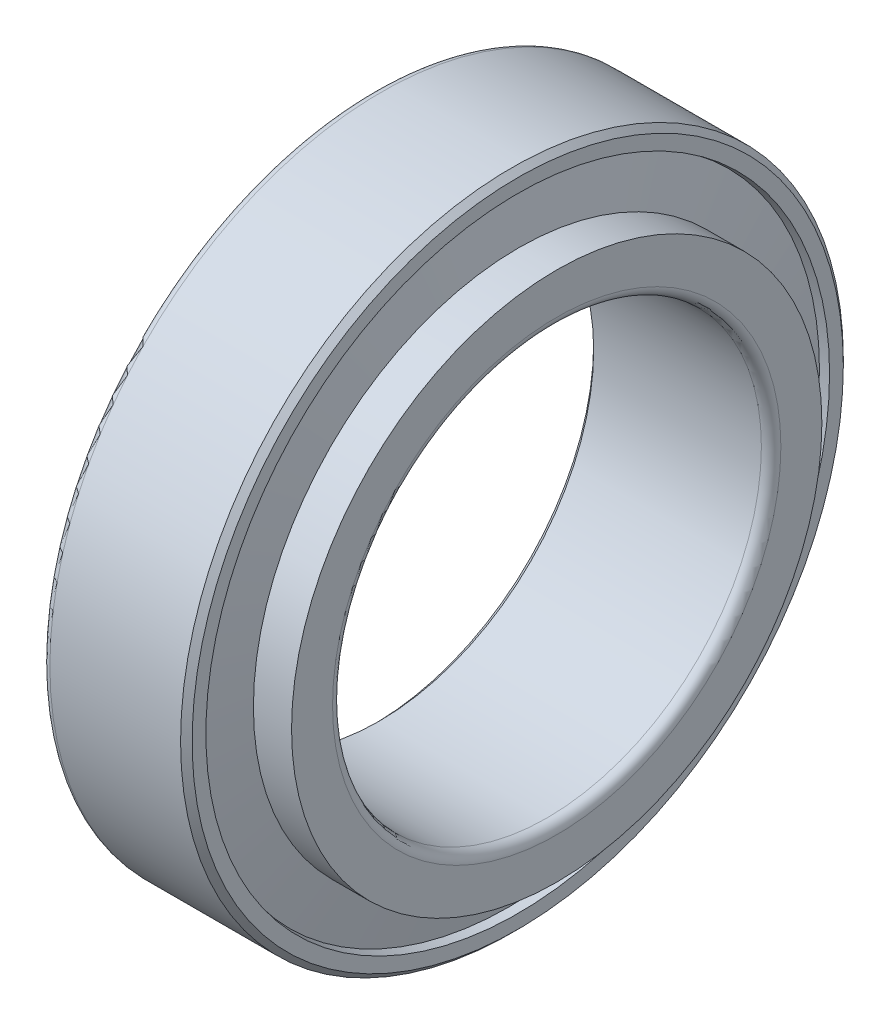
ISO-10303-21;
HEADER;
FILE_DESCRIPTION(('STEP AP214'),'2;1');
FILE_NAME('part.step','',(''),(''),'','','');
FILE_SCHEMA(('AUTOMOTIVE_DESIGN { 1 0 10303 214 1 1 1 1 }'));
ENDSEC;
DATA;
#1=APPLICATION_CONTEXT('core data for automotive mechanical design processes');
#2=APPLICATION_PROTOCOL_DEFINITION('international standard','automotive_design',2000,#1);
#3=PRODUCT_CONTEXT('',#1,'mechanical');
#4=PRODUCT('Part','Part','',(#3));
#5=PRODUCT_RELATED_PRODUCT_CATEGORY('part','',(#4));
#6=PRODUCT_DEFINITION_FORMATION('','',#4);
#7=PRODUCT_DEFINITION_CONTEXT('part definition',#1,'design');
#8=PRODUCT_DEFINITION('design','',#6,#7);
#9=PRODUCT_DEFINITION_SHAPE('','',#8);
#10=(LENGTH_UNIT() NAMED_UNIT(*) SI_UNIT(.MILLI.,.METRE.));
#11=(NAMED_UNIT(*) PLANE_ANGLE_UNIT() SI_UNIT($,.RADIAN.));
#12=(NAMED_UNIT(*) SI_UNIT($,.STERADIAN.) SOLID_ANGLE_UNIT());
#13=UNCERTAINTY_MEASURE_WITH_UNIT(LENGTH_MEASURE(1.E-05),#10,'distance_accuracy_value','');
#14=(GEOMETRIC_REPRESENTATION_CONTEXT(3) GLOBAL_UNCERTAINTY_ASSIGNED_CONTEXT((#13)) GLOBAL_UNIT_ASSIGNED_CONTEXT((#10,
#11,#12)) REPRESENTATION_CONTEXT('',''));
#15=CARTESIAN_POINT('',(0.,0.,0.));
#16=DIRECTION('',(0.,0.,1.));
#17=DIRECTION('',(1.,0.,0.));
#18=AXIS2_PLACEMENT_3D('',#15,#16,#17);
#19=CARTESIAN_POINT('',(-47.,0.,0.));
#20=DIRECTION('',(1.,0.,0.));
#21=DIRECTION('',(0.,0.,-1.));
#22=AXIS2_PLACEMENT_3D('',#19,#20,#21);
#23=CONICAL_SURFACE('',#22,73.1325,0.183259571459398);
#24=CARTESIAN_POINT('',(-44.9341470420352,0.,0.));
#25=DIRECTION('',(-1.,0.,0.));
#26=DIRECTION('',(0.,0.,1.));
#27=AXIS2_PLACEMENT_3D('',#24,#25,#26);
#28=CIRCLE('',#27,73.5153832141982);
#29=CARTESIAN_POINT('',(-44.9341470420352,0.,73.5153832141982));
#30=VERTEX_POINT('',#29);
#31=EDGE_CURVE('E41',#30,#30,#28,.T.);
#32=ORIENTED_EDGE('',*,*,#31,.F.);
#33=EDGE_LOOP('',(#32));
#34=FACE_BOUND('',#33,.T.);
#35=CARTESIAN_POINT('',(-47.,0.,0.));
#36=DIRECTION('',(1.,0.,0.));
#37=DIRECTION('',(0.,0.,-1.));
#38=AXIS2_PLACEMENT_3D('',#35,#36,#37);
#39=CIRCLE('',#38,73.1325);
#40=CARTESIAN_POINT('',(-47.,0.,-73.1325));
#41=VERTEX_POINT('',#40);
#42=EDGE_CURVE('E53',#41,#41,#39,.T.);
#43=ORIENTED_EDGE('',*,*,#42,.F.);
#44=EDGE_LOOP('',(#43));
#45=FACE_BOUND('',#44,.T.);
#46=ADVANCED_FACE('F30',(#34,#45),#23,.F.);
#47=CARTESIAN_POINT('',(-10.,83.52,0.));
#48=DIRECTION('',(1.,0.,0.));
#49=DIRECTION('',(0.,0.,-1.));
#50=AXIS2_PLACEMENT_3D('',#47,#48,#49);
#51=PLANE('',#50);
#52=CARTESIAN_POINT('',(-10.,0.,0.));
#53=DIRECTION('',(1.,0.,0.));
#54=DIRECTION('',(0.,0.,-1.));
#55=AXIS2_PLACEMENT_3D('',#52,#53,#54);
#56=CIRCLE('',#55,83.52);
#57=CARTESIAN_POINT('',(-10.,0.,-83.52));
#58=VERTEX_POINT('',#57);
#59=EDGE_CURVE('E65',#58,#58,#56,.T.);
#60=ORIENTED_EDGE('',*,*,#59,.T.);
#61=EDGE_LOOP('',(#60));
#62=FACE_BOUND('',#61,.T.);
#63=CARTESIAN_POINT('',(-10.,0.,0.));
#64=DIRECTION('',(1.,0.,0.));
#65=DIRECTION('',(0.,0.,-1.));
#66=AXIS2_PLACEMENT_3D('',#63,#64,#65);
#67=CIRCLE('',#66,79.9900446624665);
#68=CARTESIAN_POINT('',(-10.,0.,-79.9900446624665));
#69=VERTEX_POINT('',#68);
#70=EDGE_CURVE('E50',#69,#69,#67,.T.);
#71=ORIENTED_EDGE('',*,*,#70,.F.);
#72=EDGE_LOOP('',(#71));
#73=FACE_BOUND('',#72,.T.);
#74=ADVANCED_FACE('F32',(#62,#73),#51,.T.);
#75=CARTESIAN_POINT('',(-12.1917586201555,0.,0.));
#76=DIRECTION('',(-1.,0.,0.));
#77=DIRECTION('',(0.,0.,1.));
#78=AXIS2_PLACEMENT_3D('',#75,#76,#77);
#79=CIRCLE('',#78,79.5838262130865);
#80=CARTESIAN_POINT('',(-12.1917586201555,0.,79.5838262130865));
#81=VERTEX_POINT('',#80);
#82=EDGE_CURVE('E45',#81,#81,#79,.F.);
#83=ORIENTED_EDGE('',*,*,#82,.F.);
#84=EDGE_LOOP('',(#83));
#85=FACE_BOUND('',#84,.T.);
#86=ORIENTED_EDGE('',*,*,#70,.T.);
#87=EDGE_LOOP('',(#86));
#88=FACE_BOUND('',#87,.T.);
#89=ADVANCED_FACE('F118',(#85,#88),#23,.F.);
#90=CARTESIAN_POINT('',(-47.,73.1325,0.));
#91=DIRECTION('',(-1.,0.,0.));
#92=DIRECTION('',(0.,0.,1.));
#93=AXIS2_PLACEMENT_3D('',#90,#91,#92);
#94=PLANE('',#93);
#95=ORIENTED_EDGE('',*,*,#42,.T.);
#96=EDGE_LOOP('',(#95));
#97=FACE_BOUND('',#96,.T.);
#98=CARTESIAN_POINT('',(-47.,0.,0.));
#99=DIRECTION('',(1.,0.,0.));
#100=DIRECTION('',(0.,0.,-1.));
#101=AXIS2_PLACEMENT_3D('',#98,#99,#100);
#102=CIRCLE('',#101,83.);
#103=CARTESIAN_POINT('',(-47.,0.,-83.));
#104=VERTEX_POINT('',#103);
#105=EDGE_CURVE('E56',#104,#104,#102,.T.);
#106=ORIENTED_EDGE('',*,*,#105,.F.);
#107=EDGE_LOOP('',(#106));
#108=FACE_BOUND('',#107,.T.);
#109=ADVANCED_FACE('F127',(#97,#108),#94,.T.);
#110=CARTESIAN_POINT('',(-45.,0.,0.));
#111=DIRECTION('',(1.,0.,0.));
#112=DIRECTION('',(0.,0.,-1.));
#113=AXIS2_PLACEMENT_3D('',#110,#111,#112);
#114=TOROIDAL_SURFACE('',#113,83.,2.);
#115=ORIENTED_EDGE('',*,*,#105,.T.);
#116=EDGE_LOOP('',(#115));
#117=FACE_BOUND('',#116,.T.);
#118=CARTESIAN_POINT('',(-45.,0.,0.));
#119=DIRECTION('',(1.,0.,0.));
#120=DIRECTION('',(0.,0.,-1.));
#121=AXIS2_PLACEMENT_3D('',#118,#119,#120);
#122=CIRCLE('',#121,85.);
#123=CARTESIAN_POINT('',(-45.,0.,-85.));
#124=VERTEX_POINT('',#123);
#125=EDGE_CURVE('E59',#124,#124,#122,.T.);
#126=ORIENTED_EDGE('',*,*,#125,.F.);
#127=EDGE_LOOP('',(#126));
#128=FACE_BOUND('',#127,.T.);
#129=ADVANCED_FACE('F132',(#117,#128),#114,.T.);
#130=CARTESIAN_POINT('',(-42.5,0.,0.));
#131=DIRECTION('',(1.,0.,0.));
#132=DIRECTION('',(0.,0.,-1.));
#133=AXIS2_PLACEMENT_3D('',#130,#131,#132);
#134=CYLINDRICAL_SURFACE('',#133,85.);
#135=ORIENTED_EDGE('',*,*,#125,.T.);
#136=EDGE_LOOP('',(#135));
#137=FACE_BOUND('',#136,.T.);
#138=CARTESIAN_POINT('',(-11.48,0.,0.));
#139=DIRECTION('',(1.,0.,0.));
#140=DIRECTION('',(0.,0.,-1.));
#141=AXIS2_PLACEMENT_3D('',#138,#139,#140);
#142=CIRCLE('',#141,85.);
#143=CARTESIAN_POINT('',(-11.48,0.,-85.));
#144=VERTEX_POINT('',#143);
#145=EDGE_CURVE('E62',#144,#144,#142,.T.);
#146=ORIENTED_EDGE('',*,*,#145,.F.);
#147=EDGE_LOOP('',(#146));
#148=FACE_BOUND('',#147,.T.);
#149=ADVANCED_FACE('F154',(#137,#148),#134,.T.);
#150=CARTESIAN_POINT('',(-10.,0.,0.));
#151=DIRECTION('',(-1.,0.,0.));
#152=DIRECTION('',(0.,0.,1.));
#153=AXIS2_PLACEMENT_3D('',#150,#151,#152);
#154=CONICAL_SURFACE('',#153,83.52,0.785398163397444);
#155=ORIENTED_EDGE('',*,*,#145,.T.);
#156=EDGE_LOOP('',(#155));
#157=FACE_BOUND('',#156,.T.);
#158=ORIENTED_EDGE('',*,*,#59,.F.);
#159=EDGE_LOOP('',(#158));
#160=FACE_BOUND('',#159,.T.);
#161=ADVANCED_FACE('F148',(#157,#160),#154,.T.);
#162=CARTESIAN_POINT('',(-45.,0.,0.));
#163=DIRECTION('',(-1.,0.,0.));
#164=DIRECTION('',(0.,0.,1.));
#165=AXIS2_PLACEMENT_3D('',#162,#163,#164);
#166=CONICAL_SURFACE('',#165,73.870693979877,1.3875367553355);
#167=CARTESIAN_POINT('',(-42.6649242610894,0.,0.));
#168=DIRECTION('',(-1.,0.,0.));
#169=DIRECTION('',(0.,0.,1.));
#170=AXIS2_PLACEMENT_3D('',#167,#168,#169);
#171=CIRCLE('',#170,61.2717527272485);
#172=CARTESIAN_POINT('',(-42.6649242610894,0.,61.2717527272485));
#173=VERTEX_POINT('',#172);
#174=EDGE_CURVE('E10',#173,#173,#171,.T.);
#175=ORIENTED_EDGE('',*,*,#174,.F.);
#176=EDGE_LOOP('',(#175));
#177=FACE_BOUND('',#176,.T.);
#178=ORIENTED_EDGE('',*,*,#31,.T.);
#179=EDGE_LOOP('',(#178));
#180=FACE_BOUND('',#179,.T.);
#181=ADVANCED_FACE('F142',(#177,#180),#166,.F.);
#182=CARTESIAN_POINT('',(-42.5398204058561,0.,0.));
#183=DIRECTION('',(1.,0.,0.));
#184=DIRECTION('',(0.,0.,-1.));
#185=AXIS2_PLACEMENT_3D('',#182,#183,#184);
#186=CONICAL_SURFACE('',#185,60.5967527277636,0.183259571459398);
#187=CARTESIAN_POINT('',(-42.5279280208768,0.,0.));
#188=DIRECTION('',(-1.,0.,0.));
#189=DIRECTION('',(0.,0.,1.));
#190=AXIS2_PLACEMENT_3D('',#187,#188,#189);
#191=CIRCLE('',#190,60.5989568510376);
#192=CARTESIAN_POINT('',(-42.5279280208768,0.,60.5989568510376));
#193=VERTEX_POINT('',#192);
#194=EDGE_CURVE('E37',#193,#193,#191,.F.);
#195=ORIENTED_EDGE('',*,*,#194,.F.);
#196=EDGE_LOOP('',(#195));
#197=FACE_BOUND('',#196,.T.);
#198=CARTESIAN_POINT('',(-9.79743198397639,0.,0.));
#199=DIRECTION('',(1.,0.,0.));
#200=DIRECTION('',(0.,0.,-1.));
#201=AXIS2_PLACEMENT_3D('',#198,#199,#200);
#202=CIRCLE('',#201,66.6651957266519);
#203=CARTESIAN_POINT('',(-9.79743198397639,0.,-66.6651957266519));
#204=VERTEX_POINT('',#203);
#205=EDGE_CURVE('E68',#204,#204,#202,.T.);
#206=ORIENTED_EDGE('',*,*,#205,.T.);
#207=EDGE_LOOP('',(#206));
#208=FACE_BOUND('',#207,.T.);
#209=ADVANCED_FACE('F113',(#197,#208),#186,.F.);
#210=CARTESIAN_POINT('',(-9.79743198397639,0.,0.));
#211=DIRECTION('',(-1.,0.,0.));
#212=DIRECTION('',(0.,0.,1.));
#213=AXIS2_PLACEMENT_3D('',#210,#211,#212);
#214=CONICAL_SURFACE('',#213,66.6651957266519,1.3875367553355);
#215=ORIENTED_EDGE('',*,*,#82,.T.);
#216=EDGE_LOOP('',(#215));
#217=FACE_BOUND('',#216,.T.);
#218=ORIENTED_EDGE('',*,*,#205,.F.);
#219=EDGE_LOOP('',(#218));
#220=FACE_BOUND('',#219,.T.);
#221=ADVANCED_FACE('F105',(#217,#220),#214,.T.);
#222=CARTESIAN_POINT('',(-42.5275195106788,0.,0.));
#223=DIRECTION('',(-1.,0.,0.));
#224=DIRECTION('',(0.,0.,1.));
#225=AXIS2_PLACEMENT_3D('',#222,#223,#224);
#226=CONICAL_SURFACE('',#225,60.5967527272485,1.3875367553355);
#227=ORIENTED_EDGE('',*,*,#194,.T.);
#228=EDGE_LOOP('',(#227));
#229=FACE_BOUND('',#228,.T.);
#230=CARTESIAN_POINT('',(-42.5275195106788,0.,0.));
#231=DIRECTION('',(1.,0.,0.));
#232=DIRECTION('',(0.,0.,-1.));
#233=AXIS2_PLACEMENT_3D('',#230,#231,#232);
#234=CIRCLE('',#233,60.5967527272485);
#235=CARTESIAN_POINT('',(-42.5275195106788,0.,-60.5967527272485));
#236=VERTEX_POINT('',#235);
#237=EDGE_CURVE('E95',#236,#236,#234,.T.);
#238=ORIENTED_EDGE('',*,*,#237,.F.);
#239=EDGE_LOOP('',(#238));
#240=FACE_BOUND('',#239,.T.);
#241=ADVANCED_FACE('F102',(#229,#240),#226,.T.);
#242=CARTESIAN_POINT('',(-42.5,0.,0.));
#243=DIRECTION('',(1.,0.,0.));
#244=DIRECTION('',(0.,0.,-1.));
#245=AXIS2_PLACEMENT_3D('',#242,#243,#244);
#246=CYLINDRICAL_SURFACE('',#245,61.2717527272485);
#247=ORIENTED_EDGE('',*,*,#174,.T.);
#248=EDGE_LOOP('',(#247));
#249=FACE_BOUND('',#248,.T.);
#250=CARTESIAN_POINT('',(-47.,0.,0.));
#251=DIRECTION('',(1.,0.,0.));
#252=DIRECTION('',(0.,0.,-1.));
#253=AXIS2_PLACEMENT_3D('',#250,#251,#252);
#254=CIRCLE('',#253,61.2717527272485);
#255=CARTESIAN_POINT('',(-47.,0.,-61.2717527272485));
#256=VERTEX_POINT('',#255);
#257=EDGE_CURVE('E71',#256,#256,#254,.T.);
#258=ORIENTED_EDGE('',*,*,#257,.T.);
#259=EDGE_LOOP('',(#258));
#260=FACE_BOUND('',#259,.T.);
#261=ADVANCED_FACE('F104',(#249,#260),#246,.T.);
#262=CARTESIAN_POINT('',(-47.,61.2717527272485,0.));
#263=DIRECTION('',(-1.,0.,0.));
#264=DIRECTION('',(0.,0.,1.));
#265=AXIS2_PLACEMENT_3D('',#262,#263,#264);
#266=PLANE('',#265);
#267=CARTESIAN_POINT('',(-47.,0.,0.));
#268=DIRECTION('',(1.,0.,0.));
#269=DIRECTION('',(0.,0.,-1.));
#270=AXIS2_PLACEMENT_3D('',#267,#268,#269);
#271=CIRCLE('',#270,56.48);
#272=CARTESIAN_POINT('',(-47.,0.,-56.48));
#273=VERTEX_POINT('',#272);
#274=EDGE_CURVE('E74',#273,#273,#271,.T.);
#275=ORIENTED_EDGE('',*,*,#274,.T.);
#276=EDGE_LOOP('',(#275));
#277=FACE_BOUND('',#276,.T.);
#278=ORIENTED_EDGE('',*,*,#257,.F.);
#279=EDGE_LOOP('',(#278));
#280=FACE_BOUND('',#279,.T.);
#281=ADVANCED_FACE('F111',(#277,#280),#266,.T.);
#282=CARTESIAN_POINT('',(-47.,0.,0.));
#283=DIRECTION('',(-1.,0.,0.));
#284=DIRECTION('',(0.,0.,1.));
#285=AXIS2_PLACEMENT_3D('',#282,#283,#284);
#286=CONICAL_SURFACE('',#285,56.48,0.785398163397446);
#287=CARTESIAN_POINT('',(-45.52,0.,0.));
#288=DIRECTION('',(1.,0.,0.));
#289=DIRECTION('',(0.,0.,-1.));
#290=AXIS2_PLACEMENT_3D('',#287,#288,#289);
#291=CIRCLE('',#290,55.);
#292=CARTESIAN_POINT('',(-45.52,0.,-55.));
#293=VERTEX_POINT('',#292);
#294=EDGE_CURVE('E77',#293,#293,#291,.T.);
#295=ORIENTED_EDGE('',*,*,#294,.T.);
#296=EDGE_LOOP('',(#295));
#297=FACE_BOUND('',#296,.T.);
#298=ORIENTED_EDGE('',*,*,#274,.F.);
#299=EDGE_LOOP('',(#298));
#300=FACE_BOUND('',#299,.T.);
#301=ADVANCED_FACE('F212',(#297,#300),#286,.F.);
#302=CARTESIAN_POINT('',(-42.5,0.,0.));
#303=DIRECTION('',(1.,0.,0.));
#304=DIRECTION('',(0.,0.,-1.));
#305=AXIS2_PLACEMENT_3D('',#302,#303,#304);
#306=CYLINDRICAL_SURFACE('',#305,55.);
#307=CARTESIAN_POINT('',(-2.5,0.,0.));
#308=DIRECTION('',(1.,0.,0.));
#309=DIRECTION('',(0.,0.,-1.));
#310=AXIS2_PLACEMENT_3D('',#307,#308,#309);
#311=CIRCLE('',#310,55.);
#312=CARTESIAN_POINT('',(-2.5,0.,-55.));
#313=VERTEX_POINT('',#312);
#314=EDGE_CURVE('E80',#313,#313,#311,.T.);
#315=ORIENTED_EDGE('',*,*,#314,.T.);
#316=EDGE_LOOP('',(#315));
#317=FACE_BOUND('',#316,.T.);
#318=ORIENTED_EDGE('',*,*,#294,.F.);
#319=EDGE_LOOP('',(#318));
#320=FACE_BOUND('',#319,.T.);
#321=ADVANCED_FACE('F222',(#317,#320),#306,.F.);
#322=CARTESIAN_POINT('',(-2.5,0.,0.));
#323=DIRECTION('',(1.,0.,0.));
#324=DIRECTION('',(0.,0.,-1.));
#325=AXIS2_PLACEMENT_3D('',#322,#323,#324);
#326=TOROIDAL_SURFACE('',#325,57.5,2.5);
#327=CARTESIAN_POINT('',(0.,0.,0.));
#328=DIRECTION('',(1.,0.,0.));
#329=DIRECTION('',(0.,0.,-1.));
#330=AXIS2_PLACEMENT_3D('',#327,#328,#329);
#331=CIRCLE('',#330,57.5);
#332=CARTESIAN_POINT('',(0.,0.,-57.5));
#333=VERTEX_POINT('',#332);
#334=EDGE_CURVE('E83',#333,#333,#331,.T.);
#335=ORIENTED_EDGE('',*,*,#334,.T.);
#336=EDGE_LOOP('',(#335));
#337=FACE_BOUND('',#336,.T.);
#338=ORIENTED_EDGE('',*,*,#314,.F.);
#339=EDGE_LOOP('',(#338));
#340=FACE_BOUND('',#339,.T.);
#341=ADVANCED_FACE('F232',(#337,#340),#326,.T.);
#342=CARTESIAN_POINT('',(0.,57.5,0.));
#343=DIRECTION('',(1.,0.,0.));
#344=DIRECTION('',(0.,0.,-1.));
#345=AXIS2_PLACEMENT_3D('',#342,#343,#344);
#346=PLANE('',#345);
#347=CARTESIAN_POINT('',(0.,0.,0.));
#348=DIRECTION('',(1.,0.,0.));
#349=DIRECTION('',(0.,0.,-1.));
#350=AXIS2_PLACEMENT_3D('',#347,#348,#349);
#351=CIRCLE('',#350,68.0151957261368);
#352=CARTESIAN_POINT('',(0.,0.,-68.0151957261368));
#353=VERTEX_POINT('',#352);
#354=EDGE_CURVE('E86',#353,#353,#351,.T.);
#355=ORIENTED_EDGE('',*,*,#354,.T.);
#356=EDGE_LOOP('',(#355));
#357=FACE_BOUND('',#356,.T.);
#358=ORIENTED_EDGE('',*,*,#334,.F.);
#359=EDGE_LOOP('',(#358));
#360=FACE_BOUND('',#359,.T.);
#361=ADVANCED_FACE('F242',(#357,#360),#346,.T.);
#362=CARTESIAN_POINT('',(-42.5,0.,0.));
#363=DIRECTION('',(1.,0.,0.));
#364=DIRECTION('',(0.,0.,-1.));
#365=AXIS2_PLACEMENT_3D('',#362,#363,#364);
#366=CYLINDRICAL_SURFACE('',#365,68.0151957261368);
#367=CARTESIAN_POINT('',(-9.78513108879909,0.,0.));
#368=DIRECTION('',(1.,0.,0.));
#369=DIRECTION('',(0.,0.,-1.));
#370=AXIS2_PLACEMENT_3D('',#367,#368,#369);
#371=CIRCLE('',#370,68.0151957261368);
#372=CARTESIAN_POINT('',(-9.78513108879909,0.,-68.0151957261368));
#373=VERTEX_POINT('',#372);
#374=EDGE_CURVE('E89',#373,#373,#371,.T.);
#375=ORIENTED_EDGE('',*,*,#374,.T.);
#376=EDGE_LOOP('',(#375));
#377=FACE_BOUND('',#376,.T.);
#378=ORIENTED_EDGE('',*,*,#354,.F.);
#379=EDGE_LOOP('',(#378));
#380=FACE_BOUND('',#379,.T.);
#381=ADVANCED_FACE('F252',(#377,#380),#366,.T.);
#382=CARTESIAN_POINT('',(-9.78513108879909,68.0151957261368,0.));
#383=DIRECTION('',(-1.,0.,0.));
#384=DIRECTION('',(0.,0.,1.));
#385=AXIS2_PLACEMENT_3D('',#382,#383,#384);
#386=PLANE('',#385);
#387=CARTESIAN_POINT('',(-9.78513108879909,0.,0.));
#388=DIRECTION('',(1.,0.,0.));
#389=DIRECTION('',(0.,0.,-1.));
#390=AXIS2_PLACEMENT_3D('',#387,#388,#389);
#391=CIRCLE('',#390,66.6651957261368);
#392=CARTESIAN_POINT('',(-9.78513108879909,0.,-66.6651957261368));
#393=VERTEX_POINT('',#392);
#394=EDGE_CURVE('E92',#393,#393,#391,.T.);
#395=ORIENTED_EDGE('',*,*,#394,.T.);
#396=EDGE_LOOP('',(#395));
#397=FACE_BOUND('',#396,.T.);
#398=ORIENTED_EDGE('',*,*,#374,.F.);
#399=EDGE_LOOP('',(#398));
#400=FACE_BOUND('',#399,.T.);
#401=ADVANCED_FACE('F262',(#397,#400),#386,.T.);
#402=CARTESIAN_POINT('',(-9.78513108879909,0.,0.));
#403=DIRECTION('',(1.,0.,0.));
#404=DIRECTION('',(0.,0.,-1.));
#405=AXIS2_PLACEMENT_3D('',#402,#403,#404);
#406=CONICAL_SURFACE('',#405,66.6651957261368,0.183259571459398);
#407=ORIENTED_EDGE('',*,*,#237,.T.);
#408=EDGE_LOOP('',(#407));
#409=FACE_BOUND('',#408,.T.);
#410=ORIENTED_EDGE('',*,*,#394,.F.);
#411=EDGE_LOOP('',(#410));
#412=FACE_BOUND('',#411,.T.);
#413=ADVANCED_FACE('F99',(#409,#412),#406,.T.);
#414=CLOSED_SHELL('',(#46,#74,#89,#109,#129,#149,#161,#181,#209,#221,#241,#261,#281,#301,#321,
#341,#361,#381,#401,#413));
#415=MANIFOLD_SOLID_BREP('B2',#414);
#416=ADVANCED_BREP_SHAPE_REPRESENTATION('',(#18,#415),#14);
#417=SHAPE_DEFINITION_REPRESENTATION(#9,#416);
ENDSEC;
END-ISO-10303-21;
